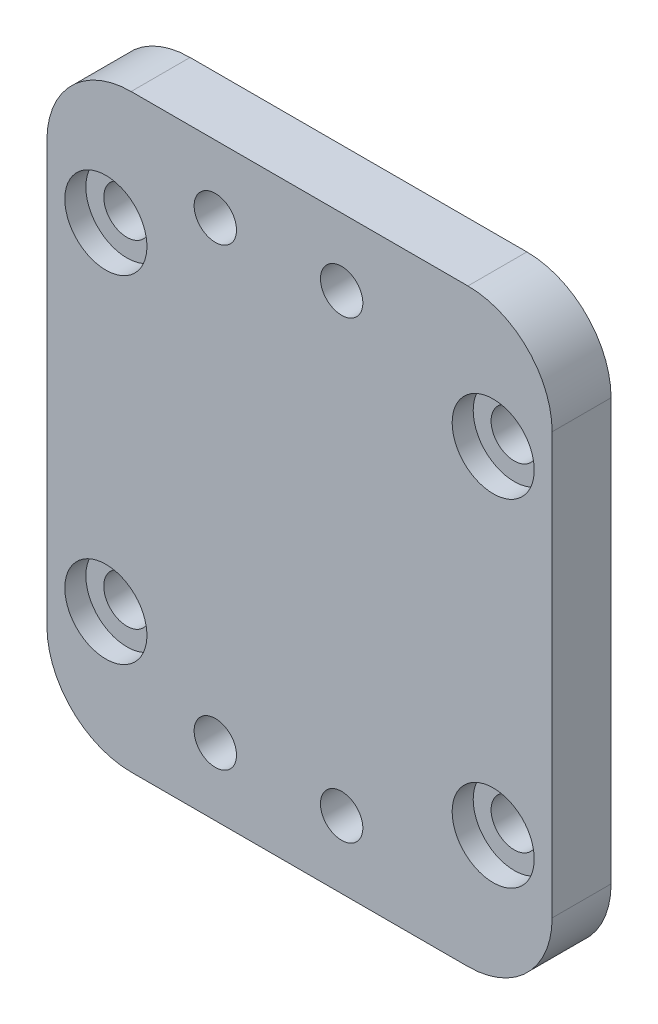
ISO-10303-21;
HEADER;
FILE_DESCRIPTION(('STEP AP214'),'2;1');
FILE_NAME('part.step','',(''),(''),'','','');
FILE_SCHEMA(('AUTOMOTIVE_DESIGN { 1 0 10303 214 1 1 1 1 }'));
ENDSEC;
DATA;
#1=APPLICATION_CONTEXT('core data for automotive mechanical design processes');
#2=APPLICATION_PROTOCOL_DEFINITION('international standard','automotive_design',2000,#1);
#3=PRODUCT_CONTEXT('',#1,'mechanical');
#4=PRODUCT('Part','Part','',(#3));
#5=PRODUCT_RELATED_PRODUCT_CATEGORY('part','',(#4));
#6=PRODUCT_DEFINITION_FORMATION('','',#4);
#7=PRODUCT_DEFINITION_CONTEXT('part definition',#1,'design');
#8=PRODUCT_DEFINITION('design','',#6,#7);
#9=PRODUCT_DEFINITION_SHAPE('','',#8);
#10=(LENGTH_UNIT() NAMED_UNIT(*) SI_UNIT(.MILLI.,.METRE.));
#11=(NAMED_UNIT(*) PLANE_ANGLE_UNIT() SI_UNIT($,.RADIAN.));
#12=(NAMED_UNIT(*) SI_UNIT($,.STERADIAN.) SOLID_ANGLE_UNIT());
#13=UNCERTAINTY_MEASURE_WITH_UNIT(LENGTH_MEASURE(1.E-05),#10,'distance_accuracy_value','');
#14=(GEOMETRIC_REPRESENTATION_CONTEXT(3) GLOBAL_UNCERTAINTY_ASSIGNED_CONTEXT((#13)) GLOBAL_UNIT_ASSIGNED_CONTEXT((#10,
#11,#12)) REPRESENTATION_CONTEXT('',''));
#15=CARTESIAN_POINT('',(0.,0.,0.));
#16=DIRECTION('',(0.,0.,1.));
#17=DIRECTION('',(1.,0.,0.));
#18=AXIS2_PLACEMENT_3D('',#15,#16,#17);
#19=CARTESIAN_POINT('',(317.067127223317,-185.815231855034,0.));
#20=DIRECTION('',(0.,0.,1.));
#21=DIRECTION('',(1.,0.,0.));
#22=AXIS2_PLACEMENT_3D('',#19,#20,#21);
#23=PLANE('',#22);
#24=CARTESIAN_POINT('',(322.067127223317,-212.815231855034,0.));
#25=DIRECTION('',(0.,0.,-1.));
#26=DIRECTION('',(1.,0.,0.));
#27=AXIS2_PLACEMENT_3D('',#24,#25,#26);
#28=CIRCLE('',#27,2.5175);
#29=CARTESIAN_POINT('',(319.549627223317,-212.815231855034,0.));
#30=VERTEX_POINT('',#29);
#31=EDGE_CURVE('E209',#30,#30,#28,.T.);
#32=ORIENTED_EDGE('',*,*,#31,.T.);
#33=EDGE_LOOP('',(#32));
#34=FACE_BOUND('',#33,.T.);
#35=CARTESIAN_POINT('',(322.067127223317,-158.815231855034,0.));
#36=DIRECTION('',(0.,0.,-1.));
#37=DIRECTION('',(1.,0.,0.));
#38=AXIS2_PLACEMENT_3D('',#35,#36,#37);
#39=CIRCLE('',#38,2.5175);
#40=CARTESIAN_POINT('',(319.549627223317,-158.815231855034,0.));
#41=VERTEX_POINT('',#40);
#42=EDGE_CURVE('E188',#41,#41,#39,.T.);
#43=ORIENTED_EDGE('',*,*,#42,.T.);
#44=EDGE_LOOP('',(#43));
#45=FACE_BOUND('',#44,.T.);
#46=CARTESIAN_POINT('',(307.067127223317,-158.815231855034,0.));
#47=DIRECTION('',(0.,0.,-1.));
#48=DIRECTION('',(1.,0.,0.));
#49=AXIS2_PLACEMENT_3D('',#46,#47,#48);
#50=CIRCLE('',#49,2.5175);
#51=CARTESIAN_POINT('',(304.549627223317,-158.815231855034,0.));
#52=VERTEX_POINT('',#51);
#53=EDGE_CURVE('E184',#52,#52,#50,.T.);
#54=ORIENTED_EDGE('',*,*,#53,.T.);
#55=EDGE_LOOP('',(#54));
#56=FACE_BOUND('',#55,.T.);
#57=CARTESIAN_POINT('',(307.067127223317,-212.815231855034,0.));
#58=DIRECTION('',(0.,0.,-1.));
#59=DIRECTION('',(1.,0.,0.));
#60=AXIS2_PLACEMENT_3D('',#57,#58,#59);
#61=CIRCLE('',#60,2.5175);
#62=CARTESIAN_POINT('',(304.549627223317,-212.815231855034,0.));
#63=VERTEX_POINT('',#62);
#64=EDGE_CURVE('E199',#63,#63,#61,.T.);
#65=ORIENTED_EDGE('',*,*,#64,.T.);
#66=EDGE_LOOP('',(#65));
#67=FACE_BOUND('',#66,.T.);
#68=CARTESIAN_POINT('',(294.067127223317,-205.815231855034,0.));
#69=DIRECTION('',(0.,0.,-1.));
#70=DIRECTION('',(1.,0.,0.));
#71=AXIS2_PLACEMENT_3D('',#68,#69,#70);
#72=CIRCLE('',#71,4.875);
#73=CARTESIAN_POINT('',(289.192127223317,-205.815231855034,0.));
#74=VERTEX_POINT('',#73);
#75=EDGE_CURVE('E306',#74,#74,#72,.T.);
#76=ORIENTED_EDGE('',*,*,#75,.T.);
#77=EDGE_LOOP('',(#76));
#78=FACE_BOUND('',#77,.T.);
#79=CARTESIAN_POINT('',(340.067127223317,-165.815231855034,0.));
#80=DIRECTION('',(0.,0.,-1.));
#81=DIRECTION('',(1.,0.,0.));
#82=AXIS2_PLACEMENT_3D('',#79,#80,#81);
#83=CIRCLE('',#82,4.875);
#84=CARTESIAN_POINT('',(335.192127223317,-165.815231855034,0.));
#85=VERTEX_POINT('',#84);
#86=EDGE_CURVE('E289',#85,#85,#83,.T.);
#87=ORIENTED_EDGE('',*,*,#86,.T.);
#88=EDGE_LOOP('',(#87));
#89=FACE_BOUND('',#88,.T.);
#90=CARTESIAN_POINT('',(294.067127223317,-165.815231855034,0.));
#91=DIRECTION('',(0.,0.,-1.));
#92=DIRECTION('',(1.,0.,0.));
#93=AXIS2_PLACEMENT_3D('',#90,#91,#92);
#94=CIRCLE('',#93,4.875);
#95=CARTESIAN_POINT('',(289.192127223317,-165.815231855034,0.));
#96=VERTEX_POINT('',#95);
#97=EDGE_CURVE('E275',#96,#96,#94,.T.);
#98=ORIENTED_EDGE('',*,*,#97,.T.);
#99=EDGE_LOOP('',(#98));
#100=FACE_BOUND('',#99,.T.);
#101=CARTESIAN_POINT('',(340.067127223317,-205.815231855034,0.));
#102=DIRECTION('',(0.,0.,-1.));
#103=DIRECTION('',(1.,0.,0.));
#104=AXIS2_PLACEMENT_3D('',#101,#102,#103);
#105=CIRCLE('',#104,4.875);
#106=CARTESIAN_POINT('',(335.192127223317,-205.815231855034,0.));
#107=VERTEX_POINT('',#106);
#108=EDGE_CURVE('E255',#107,#107,#105,.T.);
#109=ORIENTED_EDGE('',*,*,#108,.T.);
#110=EDGE_LOOP('',(#109));
#111=FACE_BOUND('',#110,.T.);
#112=CARTESIAN_POINT('',(297.067127223317,-160.815231855034,0.));
#113=DIRECTION('',(0.,0.,-1.));
#114=DIRECTION('',(-0.707106781186548,0.707106781186548,0.));
#115=AXIS2_PLACEMENT_3D('',#112,#113,#114);
#116=CIRCLE('',#115,10.);
#117=CARTESIAN_POINT('',(287.067127223317,-160.815231855034,0.));
#118=VERTEX_POINT('',#117);
#119=CARTESIAN_POINT('',(297.067127223317,-150.815231855034,0.));
#120=VERTEX_POINT('',#119);
#121=EDGE_CURVE('E343',#118,#120,#116,.T.);
#122=ORIENTED_EDGE('',*,*,#121,.F.);
#123=DIRECTION('',(0.,1.,0.));
#124=VECTOR('',#123,1.);
#125=CARTESIAN_POINT('',(287.067127223317,-220.815231855034,0.));
#126=LINE('',#125,#124);
#127=CARTESIAN_POINT('',(287.067127223317,-210.815231855034,0.));
#128=VERTEX_POINT('',#127);
#129=EDGE_CURVE('E11',#128,#118,#126,.T.);
#130=ORIENTED_EDGE('',*,*,#129,.F.);
#131=CARTESIAN_POINT('',(297.067127223317,-210.815231855034,0.));
#132=DIRECTION('',(0.,0.,-1.));
#133=DIRECTION('',(-0.707106781186548,-0.707106781186548,0.));
#134=AXIS2_PLACEMENT_3D('',#131,#132,#133);
#135=CIRCLE('',#134,10.);
#136=CARTESIAN_POINT('',(297.067127223317,-220.815231855034,0.));
#137=VERTEX_POINT('',#136);
#138=EDGE_CURVE('E408',#137,#128,#135,.T.);
#139=ORIENTED_EDGE('',*,*,#138,.F.);
#140=DIRECTION('',(-1.,0.,0.));
#141=VECTOR('',#140,1.);
#142=CARTESIAN_POINT('',(347.067127223316,-220.815231855034,0.));
#143=LINE('',#142,#141);
#144=CARTESIAN_POINT('',(337.067127223316,-220.815231855034,0.));
#145=VERTEX_POINT('',#144);
#146=EDGE_CURVE('E231',#145,#137,#143,.T.);
#147=ORIENTED_EDGE('',*,*,#146,.F.);
#148=CARTESIAN_POINT('',(337.067127223316,-210.815231855034,0.));
#149=DIRECTION('',(0.,0.,-1.));
#150=DIRECTION('',(0.707106781186548,-0.707106781186548,0.));
#151=AXIS2_PLACEMENT_3D('',#148,#149,#150);
#152=CIRCLE('',#151,10.);
#153=CARTESIAN_POINT('',(347.067127223316,-210.815231855034,0.));
#154=VERTEX_POINT('',#153);
#155=EDGE_CURVE('E229',#154,#145,#152,.T.);
#156=ORIENTED_EDGE('',*,*,#155,.F.);
#157=DIRECTION('',(0.,-1.,0.));
#158=VECTOR('',#157,1.);
#159=CARTESIAN_POINT('',(347.067127223316,-150.815231855034,0.));
#160=LINE('',#159,#158);
#161=CARTESIAN_POINT('',(347.067127223316,-160.815231855034,0.));
#162=VERTEX_POINT('',#161);
#163=EDGE_CURVE('E30',#162,#154,#160,.T.);
#164=ORIENTED_EDGE('',*,*,#163,.F.);
#165=CARTESIAN_POINT('',(337.067127223316,-160.815231855034,0.));
#166=DIRECTION('',(0.,0.,-1.));
#167=DIRECTION('',(0.707106781186548,0.707106781186548,0.));
#168=AXIS2_PLACEMENT_3D('',#165,#166,#167);
#169=CIRCLE('',#168,10.);
#170=CARTESIAN_POINT('',(337.067127223316,-150.815231855034,0.));
#171=VERTEX_POINT('',#170);
#172=EDGE_CURVE('E400',#171,#162,#169,.T.);
#173=ORIENTED_EDGE('',*,*,#172,.F.);
#174=DIRECTION('',(1.,0.,0.));
#175=VECTOR('',#174,1.);
#176=CARTESIAN_POINT('',(287.067127223317,-150.815231855034,0.));
#177=LINE('',#176,#175);
#178=EDGE_CURVE('E387',#120,#171,#177,.T.);
#179=ORIENTED_EDGE('',*,*,#178,.F.);
#180=EDGE_LOOP('',(#122,#130,#139,#147,#156,#164,#173,#179));
#181=FACE_BOUND('',#180,.T.);
#182=ADVANCED_FACE('F17',(#34,#45,#56,#67,#78,#89,#100,#111,#181),#23,.T.);
#183=CARTESIAN_POINT('',(287.067127223317,-220.815231855034,0.));
#184=DIRECTION('',(-1.,0.,0.));
#185=DIRECTION('',(0.,0.,1.));
#186=AXIS2_PLACEMENT_3D('',#183,#184,#185);
#187=PLANE('',#186);
#188=DIRECTION('',(0.,0.,1.));
#189=VECTOR('',#188,1.);
#190=CARTESIAN_POINT('',(287.067127223317,-160.815231855034,0.));
#191=LINE('',#190,#189);
#192=CARTESIAN_POINT('',(287.067127223317,-160.815231855034,-7.));
#193=VERTEX_POINT('',#192);
#194=EDGE_CURVE('E427',#193,#118,#191,.T.);
#195=ORIENTED_EDGE('',*,*,#194,.F.);
#196=DIRECTION('',(0.,1.,0.));
#197=VECTOR('',#196,1.);
#198=CARTESIAN_POINT('',(287.067127223317,-220.815231855034,-7.));
#199=LINE('',#198,#197);
#200=CARTESIAN_POINT('',(287.067127223317,-210.815231855034,-7.));
#201=VERTEX_POINT('',#200);
#202=EDGE_CURVE('E375',#201,#193,#199,.T.);
#203=ORIENTED_EDGE('',*,*,#202,.F.);
#204=DIRECTION('',(0.,0.,-1.));
#205=VECTOR('',#204,1.);
#206=CARTESIAN_POINT('',(287.067127223317,-210.815231855034,0.));
#207=LINE('',#206,#205);
#208=EDGE_CURVE('E415',#128,#201,#207,.T.);
#209=ORIENTED_EDGE('',*,*,#208,.F.);
#210=ORIENTED_EDGE('',*,*,#129,.T.);
#211=EDGE_LOOP('',(#195,#203,#209,#210));
#212=FACE_BOUND('',#211,.T.);
#213=ADVANCED_FACE('F490',(#212),#187,.T.);
#214=CARTESIAN_POINT('',(347.067127223316,-150.815231855034,0.));
#215=DIRECTION('',(1.,0.,0.));
#216=DIRECTION('',(0.,1.,0.));
#217=AXIS2_PLACEMENT_3D('',#214,#215,#216);
#218=PLANE('',#217);
#219=DIRECTION('',(0.,0.,-1.));
#220=VECTOR('',#219,1.);
#221=CARTESIAN_POINT('',(347.067127223316,-160.815231855034,0.));
#222=LINE('',#221,#220);
#223=CARTESIAN_POINT('',(347.067127223316,-160.815231855034,-7.));
#224=VERTEX_POINT('',#223);
#225=EDGE_CURVE('E221',#162,#224,#222,.T.);
#226=ORIENTED_EDGE('',*,*,#225,.F.);
#227=ORIENTED_EDGE('',*,*,#163,.T.);
#228=DIRECTION('',(0.,0.,1.));
#229=VECTOR('',#228,1.);
#230=CARTESIAN_POINT('',(347.067127223316,-210.815231855034,0.));
#231=LINE('',#230,#229);
#232=CARTESIAN_POINT('',(347.067127223316,-210.815231855034,-7.));
#233=VERTEX_POINT('',#232);
#234=EDGE_CURVE('E225',#233,#154,#231,.T.);
#235=ORIENTED_EDGE('',*,*,#234,.F.);
#236=DIRECTION('',(0.,-1.,0.));
#237=VECTOR('',#236,1.);
#238=CARTESIAN_POINT('',(347.067127223316,-150.815231855034,-7.));
#239=LINE('',#238,#237);
#240=EDGE_CURVE('E357',#224,#233,#239,.T.);
#241=ORIENTED_EDGE('',*,*,#240,.F.);
#242=EDGE_LOOP('',(#226,#227,#235,#241));
#243=FACE_BOUND('',#242,.T.);
#244=ADVANCED_FACE('F19',(#243),#218,.T.);
#245=CARTESIAN_POINT('',(322.067127223317,-212.815231855034,-3.5));
#246=DIRECTION('',(0.,0.,-1.));
#247=DIRECTION('',(1.,0.,0.));
#248=AXIS2_PLACEMENT_3D('',#245,#246,#247);
#249=CYLINDRICAL_SURFACE('',#248,2.5175);
#250=ORIENTED_EDGE('',*,*,#31,.F.);
#251=DIRECTION('',(0.,0.,-1.));
#252=VECTOR('',#251,1.);
#253=CARTESIAN_POINT('',(319.549627223317,-212.815231855034,-3.5));
#254=LINE('',#253,#252);
#255=CARTESIAN_POINT('',(319.549627223317,-212.815231855034,-7.));
#256=VERTEX_POINT('',#255);
#257=EDGE_CURVE('E39',#30,#256,#254,.T.);
#258=ORIENTED_EDGE('',*,*,#257,.T.);
#259=CARTESIAN_POINT('',(322.067127223317,-212.815231855034,-7.));
#260=DIRECTION('',(0.,0.,1.));
#261=DIRECTION('',(1.,0.,0.));
#262=AXIS2_PLACEMENT_3D('',#259,#260,#261);
#263=CIRCLE('',#262,2.5175);
#264=EDGE_CURVE('E385',#256,#256,#263,.T.);
#265=ORIENTED_EDGE('',*,*,#264,.F.);
#266=ORIENTED_EDGE('',*,*,#257,.F.);
#267=EDGE_LOOP('',(#250,#258,#265,#266));
#268=FACE_BOUND('',#267,.T.);
#269=ADVANCED_FACE('F538',(#268),#249,.F.);
#270=CARTESIAN_POINT('',(322.067127223317,-158.815231855034,-3.5));
#271=DIRECTION('',(0.,0.,-1.));
#272=DIRECTION('',(1.,0.,0.));
#273=AXIS2_PLACEMENT_3D('',#270,#271,#272);
#274=CYLINDRICAL_SURFACE('',#273,2.5175);
#275=ORIENTED_EDGE('',*,*,#42,.F.);
#276=DIRECTION('',(0.,0.,-1.));
#277=VECTOR('',#276,1.);
#278=CARTESIAN_POINT('',(319.549627223317,-158.815231855034,-3.5));
#279=LINE('',#278,#277);
#280=CARTESIAN_POINT('',(319.549627223317,-158.815231855034,-7.));
#281=VERTEX_POINT('',#280);
#282=EDGE_CURVE('E210',#41,#281,#279,.T.);
#283=ORIENTED_EDGE('',*,*,#282,.T.);
#284=CARTESIAN_POINT('',(322.067127223317,-158.815231855034,-7.));
#285=DIRECTION('',(0.,0.,1.));
#286=DIRECTION('',(1.,0.,0.));
#287=AXIS2_PLACEMENT_3D('',#284,#285,#286);
#288=CIRCLE('',#287,2.5175);
#289=EDGE_CURVE('E336',#281,#281,#288,.T.);
#290=ORIENTED_EDGE('',*,*,#289,.F.);
#291=ORIENTED_EDGE('',*,*,#282,.F.);
#292=EDGE_LOOP('',(#275,#283,#290,#291));
#293=FACE_BOUND('',#292,.T.);
#294=ADVANCED_FACE('F536',(#293),#274,.F.);
#295=CARTESIAN_POINT('',(307.067127223317,-158.815231855034,-3.5));
#296=DIRECTION('',(0.,0.,-1.));
#297=DIRECTION('',(1.,0.,0.));
#298=AXIS2_PLACEMENT_3D('',#295,#296,#297);
#299=CYLINDRICAL_SURFACE('',#298,2.5175);
#300=ORIENTED_EDGE('',*,*,#53,.F.);
#301=DIRECTION('',(0.,0.,-1.));
#302=VECTOR('',#301,1.);
#303=CARTESIAN_POINT('',(304.549627223317,-158.815231855034,-3.5));
#304=LINE('',#303,#302);
#305=CARTESIAN_POINT('',(304.549627223317,-158.815231855034,-7.));
#306=VERTEX_POINT('',#305);
#307=EDGE_CURVE('E181',#52,#306,#304,.T.);
#308=ORIENTED_EDGE('',*,*,#307,.T.);
#309=CARTESIAN_POINT('',(307.067127223317,-158.815231855034,-7.));
#310=DIRECTION('',(0.,0.,1.));
#311=DIRECTION('',(1.,0.,0.));
#312=AXIS2_PLACEMENT_3D('',#309,#310,#311);
#313=CIRCLE('',#312,2.5175);
#314=EDGE_CURVE('E190',#306,#306,#313,.T.);
#315=ORIENTED_EDGE('',*,*,#314,.F.);
#316=ORIENTED_EDGE('',*,*,#307,.F.);
#317=EDGE_LOOP('',(#300,#308,#315,#316));
#318=FACE_BOUND('',#317,.T.);
#319=ADVANCED_FACE('F182',(#318),#299,.F.);
#320=CARTESIAN_POINT('',(307.067127223317,-212.815231855034,-3.5));
#321=DIRECTION('',(0.,0.,-1.));
#322=DIRECTION('',(1.,0.,0.));
#323=AXIS2_PLACEMENT_3D('',#320,#321,#322);
#324=CYLINDRICAL_SURFACE('',#323,2.5175);
#325=ORIENTED_EDGE('',*,*,#64,.F.);
#326=DIRECTION('',(0.,0.,-1.));
#327=VECTOR('',#326,1.);
#328=CARTESIAN_POINT('',(304.549627223317,-212.815231855034,-3.5));
#329=LINE('',#328,#327);
#330=CARTESIAN_POINT('',(304.549627223317,-212.815231855034,-7.));
#331=VERTEX_POINT('',#330);
#332=EDGE_CURVE('E192',#63,#331,#329,.T.);
#333=ORIENTED_EDGE('',*,*,#332,.T.);
#334=CARTESIAN_POINT('',(307.067127223317,-212.815231855034,-7.));
#335=DIRECTION('',(0.,0.,1.));
#336=DIRECTION('',(1.,0.,0.));
#337=AXIS2_PLACEMENT_3D('',#334,#335,#336);
#338=CIRCLE('',#337,2.5175);
#339=EDGE_CURVE('E330',#331,#331,#338,.T.);
#340=ORIENTED_EDGE('',*,*,#339,.F.);
#341=ORIENTED_EDGE('',*,*,#332,.F.);
#342=EDGE_LOOP('',(#325,#333,#340,#341));
#343=FACE_BOUND('',#342,.T.);
#344=ADVANCED_FACE('F322',(#343),#324,.F.);
#345=CARTESIAN_POINT('',(294.067127223317,-205.815231855034,-3.50000000000554));
#346=DIRECTION('',(0.,0.,-1.));
#347=DIRECTION('',(1.,0.,0.));
#348=AXIS2_PLACEMENT_3D('',#345,#346,#347);
#349=CYLINDRICAL_SURFACE('',#348,2.75);
#350=CARTESIAN_POINT('',(294.067127223317,-205.815231855034,-2.50000000000554));
#351=DIRECTION('',(0.,0.,-1.));
#352=DIRECTION('',(1.,0.,0.));
#353=AXIS2_PLACEMENT_3D('',#350,#351,#352);
#354=CIRCLE('',#353,2.75);
#355=CARTESIAN_POINT('',(291.317127223317,-205.815231855034,-2.50000000000554));
#356=VERTEX_POINT('',#355);
#357=EDGE_CURVE('E302',#356,#356,#354,.T.);
#358=ORIENTED_EDGE('',*,*,#357,.F.);
#359=DIRECTION('',(0.,0.,-1.));
#360=VECTOR('',#359,1.);
#361=CARTESIAN_POINT('',(291.317127223317,-205.815231855034,-3.50000000000554));
#362=LINE('',#361,#360);
#363=CARTESIAN_POINT('',(291.317127223317,-205.815231855034,-7.));
#364=VERTEX_POINT('',#363);
#365=EDGE_CURVE('E312',#356,#364,#362,.T.);
#366=ORIENTED_EDGE('',*,*,#365,.T.);
#367=CARTESIAN_POINT('',(294.067127223317,-205.815231855034,-7.));
#368=DIRECTION('',(0.,0.,1.));
#369=DIRECTION('',(1.,0.,0.));
#370=AXIS2_PLACEMENT_3D('',#367,#368,#369);
#371=CIRCLE('',#370,2.75);
#372=EDGE_CURVE('E329',#364,#364,#371,.T.);
#373=ORIENTED_EDGE('',*,*,#372,.F.);
#374=ORIENTED_EDGE('',*,*,#365,.F.);
#375=EDGE_LOOP('',(#358,#366,#373,#374));
#376=FACE_BOUND('',#375,.T.);
#377=ADVANCED_FACE('F528',(#376),#349,.F.);
#378=CARTESIAN_POINT('',(294.067127223317,-205.815231855034,-1.25000000000554));
#379=DIRECTION('',(0.,0.,-1.));
#380=DIRECTION('',(1.,0.,0.));
#381=AXIS2_PLACEMENT_3D('',#378,#379,#380);
#382=CYLINDRICAL_SURFACE('',#381,4.875);
#383=ORIENTED_EDGE('',*,*,#75,.F.);
#384=DIRECTION('',(0.,0.,-1.));
#385=VECTOR('',#384,1.);
#386=CARTESIAN_POINT('',(289.192127223317,-205.815231855034,-1.25000000000554));
#387=LINE('',#386,#385);
#388=CARTESIAN_POINT('',(289.192127223317,-205.815231855034,-2.50000000000554));
#389=VERTEX_POINT('',#388);
#390=EDGE_CURVE('E315',#74,#389,#387,.T.);
#391=ORIENTED_EDGE('',*,*,#390,.T.);
#392=CARTESIAN_POINT('',(294.067127223317,-205.815231855034,-2.50000000000554));
#393=DIRECTION('',(0.,0.,-1.));
#394=DIRECTION('',(1.,0.,0.));
#395=AXIS2_PLACEMENT_3D('',#392,#393,#394);
#396=CIRCLE('',#395,4.875);
#397=EDGE_CURVE('E299',#389,#389,#396,.T.);
#398=ORIENTED_EDGE('',*,*,#397,.T.);
#399=ORIENTED_EDGE('',*,*,#390,.F.);
#400=EDGE_LOOP('',(#383,#391,#398,#399));
#401=FACE_BOUND('',#400,.T.);
#402=ADVANCED_FACE('F522',(#401),#382,.F.);
#403=CARTESIAN_POINT('',(294.067127223317,-205.815231855034,-2.50000000000554));
#404=DIRECTION('',(0.,0.,-1.));
#405=DIRECTION('',(0.,-1.,0.));
#406=AXIS2_PLACEMENT_3D('',#403,#404,#405);
#407=PLANE('',#406);
#408=ORIENTED_EDGE('',*,*,#357,.T.);
#409=EDGE_LOOP('',(#408));
#410=FACE_BOUND('',#409,.T.);
#411=ORIENTED_EDGE('',*,*,#397,.F.);
#412=EDGE_LOOP('',(#411));
#413=FACE_BOUND('',#412,.T.);
#414=ADVANCED_FACE('F525',(#410,#413),#407,.F.);
#415=CARTESIAN_POINT('',(340.067127223317,-165.815231855034,-3.49999999999995));
#416=DIRECTION('',(0.,0.,-1.));
#417=DIRECTION('',(1.,0.,0.));
#418=AXIS2_PLACEMENT_3D('',#415,#416,#417);
#419=CYLINDRICAL_SURFACE('',#418,2.75);
#420=CARTESIAN_POINT('',(340.067127223317,-165.815231855034,-2.49999999999995));
#421=DIRECTION('',(0.,0.,-1.));
#422=DIRECTION('',(1.,0.,0.));
#423=AXIS2_PLACEMENT_3D('',#420,#421,#422);
#424=CIRCLE('',#423,2.75);
#425=CARTESIAN_POINT('',(337.317127223317,-165.815231855034,-2.49999999999995));
#426=VERTEX_POINT('',#425);
#427=EDGE_CURVE('E286',#426,#426,#424,.T.);
#428=ORIENTED_EDGE('',*,*,#427,.F.);
#429=DIRECTION('',(0.,0.,-1.));
#430=VECTOR('',#429,1.);
#431=CARTESIAN_POINT('',(337.317127223317,-165.815231855034,-3.49999999999995));
#432=LINE('',#431,#430);
#433=CARTESIAN_POINT('',(337.317127223317,-165.815231855034,-7.));
#434=VERTEX_POINT('',#433);
#435=EDGE_CURVE('E300',#426,#434,#432,.T.);
#436=ORIENTED_EDGE('',*,*,#435,.T.);
#437=CARTESIAN_POINT('',(340.067127223317,-165.815231855034,-7.));
#438=DIRECTION('',(0.,0.,1.));
#439=DIRECTION('',(1.,0.,0.));
#440=AXIS2_PLACEMENT_3D('',#437,#438,#439);
#441=CIRCLE('',#440,2.75);
#442=EDGE_CURVE('E338',#434,#434,#441,.T.);
#443=ORIENTED_EDGE('',*,*,#442,.F.);
#444=ORIENTED_EDGE('',*,*,#435,.F.);
#445=EDGE_LOOP('',(#428,#436,#443,#444));
#446=FACE_BOUND('',#445,.T.);
#447=ADVANCED_FACE('F517',(#446),#419,.F.);
#448=CARTESIAN_POINT('',(340.067127223317,-165.815231855034,-1.24999999999995));
#449=DIRECTION('',(0.,0.,-1.));
#450=DIRECTION('',(1.,0.,0.));
#451=AXIS2_PLACEMENT_3D('',#448,#449,#450);
#452=CYLINDRICAL_SURFACE('',#451,4.875);
#453=ORIENTED_EDGE('',*,*,#86,.F.);
#454=DIRECTION('',(0.,0.,-1.));
#455=VECTOR('',#454,1.);
#456=CARTESIAN_POINT('',(335.192127223317,-165.815231855034,-1.24999999999995));
#457=LINE('',#456,#455);
#458=CARTESIAN_POINT('',(335.192127223317,-165.815231855034,-2.49999999999995));
#459=VERTEX_POINT('',#458);
#460=EDGE_CURVE('E292',#85,#459,#457,.T.);
#461=ORIENTED_EDGE('',*,*,#460,.T.);
#462=CARTESIAN_POINT('',(340.067127223317,-165.815231855034,-2.49999999999995));
#463=DIRECTION('',(0.,0.,-1.));
#464=DIRECTION('',(1.,0.,0.));
#465=AXIS2_PLACEMENT_3D('',#462,#463,#464);
#466=CIRCLE('',#465,4.875);
#467=EDGE_CURVE('E282',#459,#459,#466,.T.);
#468=ORIENTED_EDGE('',*,*,#467,.T.);
#469=ORIENTED_EDGE('',*,*,#460,.F.);
#470=EDGE_LOOP('',(#453,#461,#468,#469));
#471=FACE_BOUND('',#470,.T.);
#472=ADVANCED_FACE('F512',(#471),#452,.F.);
#473=CARTESIAN_POINT('',(340.067127223317,-165.815231855034,-2.49999999999995));
#474=DIRECTION('',(0.,0.,-1.));
#475=DIRECTION('',(0.,-1.,0.));
#476=AXIS2_PLACEMENT_3D('',#473,#474,#475);
#477=PLANE('',#476);
#478=ORIENTED_EDGE('',*,*,#427,.T.);
#479=EDGE_LOOP('',(#478));
#480=FACE_BOUND('',#479,.T.);
#481=ORIENTED_EDGE('',*,*,#467,.F.);
#482=EDGE_LOOP('',(#481));
#483=FACE_BOUND('',#482,.T.);
#484=ADVANCED_FACE('F520',(#480,#483),#477,.F.);
#485=CARTESIAN_POINT('',(294.067127223317,-165.815231855034,-3.5));
#486=DIRECTION('',(0.,0.,-1.));
#487=DIRECTION('',(1.,0.,0.));
#488=AXIS2_PLACEMENT_3D('',#485,#486,#487);
#489=CYLINDRICAL_SURFACE('',#488,2.75);
#490=CARTESIAN_POINT('',(294.067127223317,-165.815231855034,-2.5));
#491=DIRECTION('',(0.,0.,-1.));
#492=DIRECTION('',(1.,0.,0.));
#493=AXIS2_PLACEMENT_3D('',#490,#491,#492);
#494=CIRCLE('',#493,2.75);
#495=CARTESIAN_POINT('',(291.317127223317,-165.815231855034,-2.5));
#496=VERTEX_POINT('',#495);
#497=EDGE_CURVE('E268',#496,#496,#494,.T.);
#498=ORIENTED_EDGE('',*,*,#497,.F.);
#499=DIRECTION('',(0.,0.,-1.));
#500=VECTOR('',#499,1.);
#501=CARTESIAN_POINT('',(291.317127223317,-165.815231855034,-3.5));
#502=LINE('',#501,#500);
#503=CARTESIAN_POINT('',(291.317127223317,-165.815231855034,-7.));
#504=VERTEX_POINT('',#503);
#505=EDGE_CURVE('E276',#496,#504,#502,.T.);
#506=ORIENTED_EDGE('',*,*,#505,.T.);
#507=CARTESIAN_POINT('',(294.067127223317,-165.815231855034,-7.));
#508=DIRECTION('',(0.,0.,1.));
#509=DIRECTION('',(1.,0.,0.));
#510=AXIS2_PLACEMENT_3D('',#507,#508,#509);
#511=CIRCLE('',#510,2.75);
#512=EDGE_CURVE('E349',#504,#504,#511,.T.);
#513=ORIENTED_EDGE('',*,*,#512,.F.);
#514=ORIENTED_EDGE('',*,*,#505,.F.);
#515=EDGE_LOOP('',(#498,#506,#513,#514));
#516=FACE_BOUND('',#515,.T.);
#517=ADVANCED_FACE('F496',(#516),#489,.F.);
#518=CARTESIAN_POINT('',(294.067127223317,-165.815231855034,-1.25));
#519=DIRECTION('',(0.,0.,-1.));
#520=DIRECTION('',(1.,0.,0.));
#521=AXIS2_PLACEMENT_3D('',#518,#519,#520);
#522=CYLINDRICAL_SURFACE('',#521,4.875);
#523=ORIENTED_EDGE('',*,*,#97,.F.);
#524=DIRECTION('',(0.,0.,-1.));
#525=VECTOR('',#524,1.);
#526=CARTESIAN_POINT('',(289.192127223317,-165.815231855034,-1.25));
#527=LINE('',#526,#525);
#528=CARTESIAN_POINT('',(289.192127223317,-165.815231855034,-2.5));
#529=VERTEX_POINT('',#528);
#530=EDGE_CURVE('E277',#96,#529,#527,.T.);
#531=ORIENTED_EDGE('',*,*,#530,.T.);
#532=CARTESIAN_POINT('',(294.067127223317,-165.815231855034,-2.5));
#533=DIRECTION('',(0.,0.,-1.));
#534=DIRECTION('',(1.,0.,0.));
#535=AXIS2_PLACEMENT_3D('',#532,#533,#534);
#536=CIRCLE('',#535,4.875);
#537=EDGE_CURVE('E262',#529,#529,#536,.T.);
#538=ORIENTED_EDGE('',*,*,#537,.T.);
#539=ORIENTED_EDGE('',*,*,#530,.F.);
#540=EDGE_LOOP('',(#523,#531,#538,#539));
#541=FACE_BOUND('',#540,.T.);
#542=ADVANCED_FACE('F570',(#541),#522,.F.);
#543=CARTESIAN_POINT('',(294.067127223317,-165.815231855034,-2.5));
#544=DIRECTION('',(0.,0.,-1.));
#545=DIRECTION('',(0.,-1.,0.));
#546=AXIS2_PLACEMENT_3D('',#543,#544,#545);
#547=PLANE('',#546);
#548=ORIENTED_EDGE('',*,*,#497,.T.);
#549=EDGE_LOOP('',(#548));
#550=FACE_BOUND('',#549,.T.);
#551=ORIENTED_EDGE('',*,*,#537,.F.);
#552=EDGE_LOOP('',(#551));
#553=FACE_BOUND('',#552,.T.);
#554=ADVANCED_FACE('F505',(#550,#553),#547,.F.);
#555=CARTESIAN_POINT('',(340.067127223317,-205.815231855034,-3.50000000000549));
#556=DIRECTION('',(0.,0.,-1.));
#557=DIRECTION('',(1.,0.,0.));
#558=AXIS2_PLACEMENT_3D('',#555,#556,#557);
#559=CYLINDRICAL_SURFACE('',#558,2.75);
#560=CARTESIAN_POINT('',(340.067127223317,-205.815231855034,-2.50000000000549));
#561=DIRECTION('',(0.,0.,-1.));
#562=DIRECTION('',(1.,0.,0.));
#563=AXIS2_PLACEMENT_3D('',#560,#561,#562);
#564=CIRCLE('',#563,2.75);
#565=CARTESIAN_POINT('',(337.317127223317,-205.815231855034,-2.50000000000549));
#566=VERTEX_POINT('',#565);
#567=EDGE_CURVE('E249',#566,#566,#564,.T.);
#568=ORIENTED_EDGE('',*,*,#567,.F.);
#569=DIRECTION('',(0.,0.,-1.));
#570=VECTOR('',#569,1.);
#571=CARTESIAN_POINT('',(337.317127223317,-205.815231855034,-3.50000000000549));
#572=LINE('',#571,#570);
#573=CARTESIAN_POINT('',(337.317127223317,-205.815231855034,-7.));
#574=VERTEX_POINT('',#573);
#575=EDGE_CURVE('E261',#566,#574,#572,.T.);
#576=ORIENTED_EDGE('',*,*,#575,.T.);
#577=CARTESIAN_POINT('',(340.067127223317,-205.815231855034,-7.));
#578=DIRECTION('',(0.,0.,1.));
#579=DIRECTION('',(1.,0.,0.));
#580=AXIS2_PLACEMENT_3D('',#577,#578,#579);
#581=CIRCLE('',#580,2.75);
#582=EDGE_CURVE('E353',#574,#574,#581,.T.);
#583=ORIENTED_EDGE('',*,*,#582,.F.);
#584=ORIENTED_EDGE('',*,*,#575,.F.);
#585=EDGE_LOOP('',(#568,#576,#583,#584));
#586=FACE_BOUND('',#585,.T.);
#587=ADVANCED_FACE('F501',(#586),#559,.F.);
#588=CARTESIAN_POINT('',(340.067127223317,-205.815231855034,-1.25000000000549));
#589=DIRECTION('',(0.,0.,-1.));
#590=DIRECTION('',(1.,0.,0.));
#591=AXIS2_PLACEMENT_3D('',#588,#589,#590);
#592=CYLINDRICAL_SURFACE('',#591,4.875);
#593=ORIENTED_EDGE('',*,*,#108,.F.);
#594=DIRECTION('',(0.,0.,-1.));
#595=VECTOR('',#594,1.);
#596=CARTESIAN_POINT('',(335.192127223317,-205.815231855034,-1.25000000000549));
#597=LINE('',#596,#595);
#598=CARTESIAN_POINT('',(335.192127223317,-205.815231855034,-2.50000000000549));
#599=VERTEX_POINT('',#598);
#600=EDGE_CURVE('E256',#107,#599,#597,.T.);
#601=ORIENTED_EDGE('',*,*,#600,.T.);
#602=CARTESIAN_POINT('',(340.067127223317,-205.815231855034,-2.50000000000549));
#603=DIRECTION('',(0.,0.,-1.));
#604=DIRECTION('',(1.,0.,0.));
#605=AXIS2_PLACEMENT_3D('',#602,#603,#604);
#606=CIRCLE('',#605,4.875);
#607=EDGE_CURVE('E234',#599,#599,#606,.T.);
#608=ORIENTED_EDGE('',*,*,#607,.T.);
#609=ORIENTED_EDGE('',*,*,#600,.F.);
#610=EDGE_LOOP('',(#593,#601,#608,#609));
#611=FACE_BOUND('',#610,.T.);
#612=ADVANCED_FACE('F503',(#611),#592,.F.);
#613=CARTESIAN_POINT('',(340.067127223317,-205.815231855034,-2.50000000000549));
#614=DIRECTION('',(0.,0.,-1.));
#615=DIRECTION('',(0.,-1.,0.));
#616=AXIS2_PLACEMENT_3D('',#613,#614,#615);
#617=PLANE('',#616);
#618=ORIENTED_EDGE('',*,*,#567,.T.);
#619=EDGE_LOOP('',(#618));
#620=FACE_BOUND('',#619,.T.);
#621=ORIENTED_EDGE('',*,*,#607,.F.);
#622=EDGE_LOOP('',(#621));
#623=FACE_BOUND('',#622,.T.);
#624=ADVANCED_FACE('F510',(#620,#623),#617,.F.);
#625=CARTESIAN_POINT('',(337.067127223316,-210.815231855034,0.));
#626=DIRECTION('',(0.,0.,-1.));
#627=DIRECTION('',(0.707106781186548,-0.707106781186548,0.));
#628=AXIS2_PLACEMENT_3D('',#625,#626,#627);
#629=CYLINDRICAL_SURFACE('',#628,10.);
#630=CARTESIAN_POINT('',(337.067127223316,-210.815231855034,-7.));
#631=DIRECTION('',(0.,0.,1.));
#632=DIRECTION('',(0.707106781186548,-0.707106781186548,0.));
#633=AXIS2_PLACEMENT_3D('',#630,#631,#632);
#634=CIRCLE('',#633,10.);
#635=CARTESIAN_POINT('',(337.067127223316,-220.815231855034,-7.));
#636=VERTEX_POINT('',#635);
#637=EDGE_CURVE('E237',#636,#233,#634,.T.);
#638=ORIENTED_EDGE('',*,*,#637,.T.);
#639=ORIENTED_EDGE('',*,*,#234,.T.);
#640=ORIENTED_EDGE('',*,*,#155,.T.);
#641=DIRECTION('',(0.,0.,-1.));
#642=VECTOR('',#641,1.);
#643=CARTESIAN_POINT('',(337.067127223316,-220.815231855034,0.));
#644=LINE('',#643,#642);
#645=EDGE_CURVE('E246',#145,#636,#644,.T.);
#646=ORIENTED_EDGE('',*,*,#645,.T.);
#647=EDGE_LOOP('',(#638,#639,#640,#646));
#648=FACE_BOUND('',#647,.T.);
#649=ADVANCED_FACE('F236',(#648),#629,.T.);
#650=CARTESIAN_POINT('',(347.067127223316,-220.815231855034,0.));
#651=DIRECTION('',(0.,-1.,0.));
#652=DIRECTION('',(0.,0.,-1.));
#653=AXIS2_PLACEMENT_3D('',#650,#651,#652);
#654=PLANE('',#653);
#655=DIRECTION('',(0.,0.,1.));
#656=VECTOR('',#655,1.);
#657=CARTESIAN_POINT('',(297.067127223317,-220.815231855034,0.));
#658=LINE('',#657,#656);
#659=CARTESIAN_POINT('',(297.067127223317,-220.815231855034,-7.));
#660=VERTEX_POINT('',#659);
#661=EDGE_CURVE('E404',#660,#137,#658,.T.);
#662=ORIENTED_EDGE('',*,*,#661,.F.);
#663=DIRECTION('',(-1.,0.,0.));
#664=VECTOR('',#663,1.);
#665=CARTESIAN_POINT('',(347.067127223316,-220.815231855034,-7.));
#666=LINE('',#665,#664);
#667=EDGE_CURVE('E368',#636,#660,#666,.T.);
#668=ORIENTED_EDGE('',*,*,#667,.F.);
#669=ORIENTED_EDGE('',*,*,#645,.F.);
#670=ORIENTED_EDGE('',*,*,#146,.T.);
#671=EDGE_LOOP('',(#662,#668,#669,#670));
#672=FACE_BOUND('',#671,.T.);
#673=ADVANCED_FACE('F467',(#672),#654,.T.);
#674=CARTESIAN_POINT('',(297.067127223317,-210.815231855034,0.));
#675=DIRECTION('',(0.,0.,-1.));
#676=DIRECTION('',(-0.707106781186548,-0.707106781186548,0.));
#677=AXIS2_PLACEMENT_3D('',#674,#675,#676);
#678=CYLINDRICAL_SURFACE('',#677,10.);
#679=CARTESIAN_POINT('',(297.067127223317,-210.815231855034,-7.));
#680=DIRECTION('',(0.,0.,1.));
#681=DIRECTION('',(-0.707106781186548,-0.707106781186548,0.));
#682=AXIS2_PLACEMENT_3D('',#679,#680,#681);
#683=CIRCLE('',#682,10.);
#684=EDGE_CURVE('E366',#201,#660,#683,.T.);
#685=ORIENTED_EDGE('',*,*,#684,.T.);
#686=ORIENTED_EDGE('',*,*,#661,.T.);
#687=ORIENTED_EDGE('',*,*,#138,.T.);
#688=ORIENTED_EDGE('',*,*,#208,.T.);
#689=EDGE_LOOP('',(#685,#686,#687,#688));
#690=FACE_BOUND('',#689,.T.);
#691=ADVANCED_FACE('F469',(#690),#678,.T.);
#692=CARTESIAN_POINT('',(337.067127223316,-160.815231855034,0.));
#693=DIRECTION('',(0.,0.,-1.));
#694=DIRECTION('',(0.707106781186548,0.707106781186548,0.));
#695=AXIS2_PLACEMENT_3D('',#692,#693,#694);
#696=CYLINDRICAL_SURFACE('',#695,10.);
#697=CARTESIAN_POINT('',(337.067127223316,-160.815231855034,-7.));
#698=DIRECTION('',(0.,0.,1.));
#699=DIRECTION('',(0.707106781186548,0.707106781186548,0.));
#700=AXIS2_PLACEMENT_3D('',#697,#698,#699);
#701=CIRCLE('',#700,10.);
#702=CARTESIAN_POINT('',(337.067127223316,-150.815231855034,-7.));
#703=VERTEX_POINT('',#702);
#704=EDGE_CURVE('E354',#224,#703,#701,.T.);
#705=ORIENTED_EDGE('',*,*,#704,.T.);
#706=DIRECTION('',(0.,0.,1.));
#707=VECTOR('',#706,1.);
#708=CARTESIAN_POINT('',(337.067127223316,-150.815231855034,0.));
#709=LINE('',#708,#707);
#710=EDGE_CURVE('E394',#703,#171,#709,.T.);
#711=ORIENTED_EDGE('',*,*,#710,.T.);
#712=ORIENTED_EDGE('',*,*,#172,.T.);
#713=ORIENTED_EDGE('',*,*,#225,.T.);
#714=EDGE_LOOP('',(#705,#711,#712,#713));
#715=FACE_BOUND('',#714,.T.);
#716=ADVANCED_FACE('F472',(#715),#696,.T.);
#717=CARTESIAN_POINT('',(287.067127223317,-150.815231855034,0.));
#718=DIRECTION('',(0.,1.,0.));
#719=DIRECTION('',(1.,0.,0.));
#720=AXIS2_PLACEMENT_3D('',#717,#718,#719);
#721=PLANE('',#720);
#722=DIRECTION('',(0.,0.,-1.));
#723=VECTOR('',#722,1.);
#724=CARTESIAN_POINT('',(297.067127223317,-150.815231855034,0.));
#725=LINE('',#724,#723);
#726=CARTESIAN_POINT('',(297.067127223317,-150.815231855034,-7.));
#727=VERTEX_POINT('',#726);
#728=EDGE_CURVE('E344',#120,#727,#725,.T.);
#729=ORIENTED_EDGE('',*,*,#728,.F.);
#730=ORIENTED_EDGE('',*,*,#178,.T.);
#731=ORIENTED_EDGE('',*,*,#710,.F.);
#732=DIRECTION('',(1.,0.,0.));
#733=VECTOR('',#732,1.);
#734=CARTESIAN_POINT('',(287.067127223317,-150.815231855034,-7.));
#735=LINE('',#734,#733);
#736=EDGE_CURVE('E347',#727,#703,#735,.T.);
#737=ORIENTED_EDGE('',*,*,#736,.F.);
#738=EDGE_LOOP('',(#729,#730,#731,#737));
#739=FACE_BOUND('',#738,.T.);
#740=ADVANCED_FACE('F471',(#739),#721,.T.);
#741=CARTESIAN_POINT('',(317.067127223317,-185.815231855034,-7.));
#742=DIRECTION('',(0.,0.,-1.));
#743=DIRECTION('',(0.,-1.,0.));
#744=AXIS2_PLACEMENT_3D('',#741,#742,#743);
#745=PLANE('',#744);
#746=ORIENTED_EDGE('',*,*,#264,.T.);
#747=EDGE_LOOP('',(#746));
#748=FACE_BOUND('',#747,.T.);
#749=ORIENTED_EDGE('',*,*,#289,.T.);
#750=EDGE_LOOP('',(#749));
#751=FACE_BOUND('',#750,.T.);
#752=ORIENTED_EDGE('',*,*,#314,.T.);
#753=EDGE_LOOP('',(#752));
#754=FACE_BOUND('',#753,.T.);
#755=ORIENTED_EDGE('',*,*,#339,.T.);
#756=EDGE_LOOP('',(#755));
#757=FACE_BOUND('',#756,.T.);
#758=ORIENTED_EDGE('',*,*,#372,.T.);
#759=EDGE_LOOP('',(#758));
#760=FACE_BOUND('',#759,.T.);
#761=ORIENTED_EDGE('',*,*,#442,.T.);
#762=EDGE_LOOP('',(#761));
#763=FACE_BOUND('',#762,.T.);
#764=ORIENTED_EDGE('',*,*,#512,.T.);
#765=EDGE_LOOP('',(#764));
#766=FACE_BOUND('',#765,.T.);
#767=ORIENTED_EDGE('',*,*,#582,.T.);
#768=EDGE_LOOP('',(#767));
#769=FACE_BOUND('',#768,.T.);
#770=CARTESIAN_POINT('',(297.067127223317,-160.815231855034,-7.));
#771=DIRECTION('',(0.,0.,1.));
#772=DIRECTION('',(-0.707106781186548,0.707106781186548,0.));
#773=AXIS2_PLACEMENT_3D('',#770,#771,#772);
#774=CIRCLE('',#773,10.);
#775=EDGE_CURVE('E426',#727,#193,#774,.T.);
#776=ORIENTED_EDGE('',*,*,#775,.F.);
#777=ORIENTED_EDGE('',*,*,#736,.T.);
#778=ORIENTED_EDGE('',*,*,#704,.F.);
#779=ORIENTED_EDGE('',*,*,#240,.T.);
#780=ORIENTED_EDGE('',*,*,#637,.F.);
#781=ORIENTED_EDGE('',*,*,#667,.T.);
#782=ORIENTED_EDGE('',*,*,#684,.F.);
#783=ORIENTED_EDGE('',*,*,#202,.T.);
#784=EDGE_LOOP('',(#776,#777,#778,#779,#780,#781,#782,#783));
#785=FACE_BOUND('',#784,.T.);
#786=ADVANCED_FACE('F447',(#748,#751,#754,#757,#760,#763,#766,#769,#785),#745,.T.);
#787=CARTESIAN_POINT('',(297.067127223317,-160.815231855034,0.));
#788=DIRECTION('',(0.,0.,-1.));
#789=DIRECTION('',(-0.707106781186548,0.707106781186548,0.));
#790=AXIS2_PLACEMENT_3D('',#787,#788,#789);
#791=CYLINDRICAL_SURFACE('',#790,10.);
#792=ORIENTED_EDGE('',*,*,#775,.T.);
#793=ORIENTED_EDGE('',*,*,#194,.T.);
#794=ORIENTED_EDGE('',*,*,#121,.T.);
#795=ORIENTED_EDGE('',*,*,#728,.T.);
#796=EDGE_LOOP('',(#792,#793,#794,#795));
#797=FACE_BOUND('',#796,.T.);
#798=ADVANCED_FACE('F444',(#797),#791,.T.);
#799=CLOSED_SHELL('',(#182,#213,#244,#269,#294,#319,#344,#377,#402,#414,#447,#472,#484,#517,
#542,#554,#587,#612,#624,#649,#673,#691,#716,#740,#786,#798));
#800=MANIFOLD_SOLID_BREP('B1',#799);
#801=ADVANCED_BREP_SHAPE_REPRESENTATION('',(#18,#800),#14);
#802=SHAPE_DEFINITION_REPRESENTATION(#9,#801);
ENDSEC;
END-ISO-10303-21;
